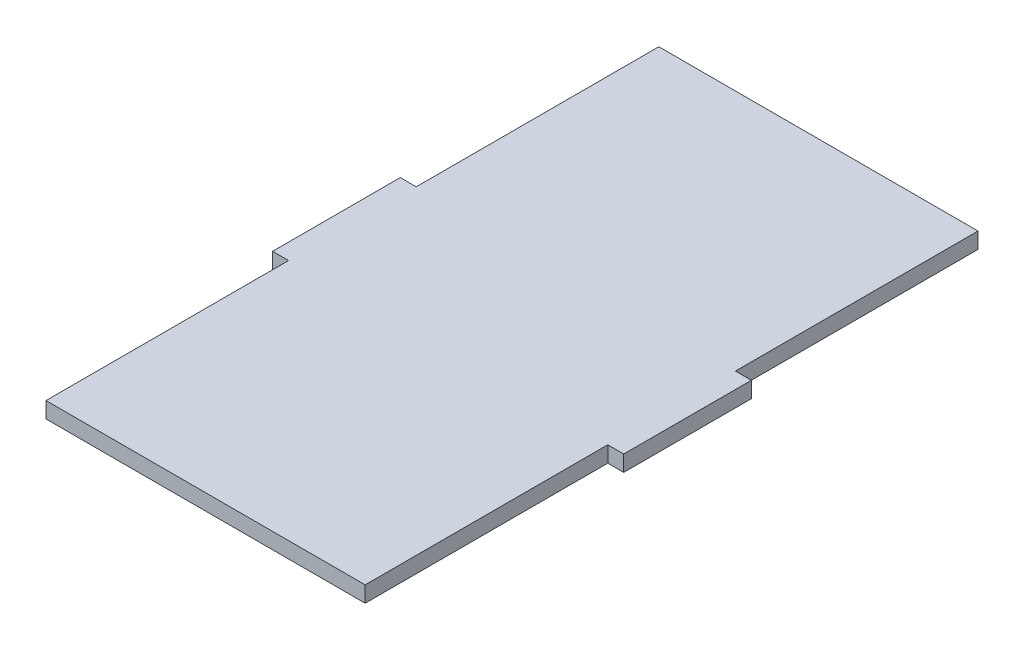
ISO-10303-21;
HEADER;
FILE_DESCRIPTION(('STEP AP214'),'2;1');
FILE_NAME('part.step','',(''),(''),'','','');
FILE_SCHEMA(('AUTOMOTIVE_DESIGN { 1 0 10303 214 1 1 1 1 }'));
ENDSEC;
DATA;
#1=APPLICATION_CONTEXT('core data for automotive mechanical design processes');
#2=APPLICATION_PROTOCOL_DEFINITION('international standard','automotive_design',2000,#1);
#3=PRODUCT_CONTEXT('',#1,'mechanical');
#4=PRODUCT('Part','Part','',(#3));
#5=PRODUCT_RELATED_PRODUCT_CATEGORY('part','',(#4));
#6=PRODUCT_DEFINITION_FORMATION('','',#4);
#7=PRODUCT_DEFINITION_CONTEXT('part definition',#1,'design');
#8=PRODUCT_DEFINITION('design','',#6,#7);
#9=PRODUCT_DEFINITION_SHAPE('','',#8);
#10=(LENGTH_UNIT() NAMED_UNIT(*) SI_UNIT(.MILLI.,.METRE.));
#11=(NAMED_UNIT(*) PLANE_ANGLE_UNIT() SI_UNIT($,.RADIAN.));
#12=(NAMED_UNIT(*) SI_UNIT($,.STERADIAN.) SOLID_ANGLE_UNIT());
#13=UNCERTAINTY_MEASURE_WITH_UNIT(LENGTH_MEASURE(1.E-05),#10,'distance_accuracy_value','');
#14=(GEOMETRIC_REPRESENTATION_CONTEXT(3) GLOBAL_UNCERTAINTY_ASSIGNED_CONTEXT((#13)) GLOBAL_UNIT_ASSIGNED_CONTEXT((#10,
#11,#12)) REPRESENTATION_CONTEXT('',''));
#15=CARTESIAN_POINT('',(0.,0.,0.));
#16=DIRECTION('',(0.,0.,1.));
#17=DIRECTION('',(1.,0.,0.));
#18=AXIS2_PLACEMENT_3D('',#15,#16,#17);
#19=CARTESIAN_POINT('',(0.,3.175,-19.05));
#20=DIRECTION('',(0.,0.,-1.));
#21=DIRECTION('',(-1.,0.,0.));
#22=AXIS2_PLACEMENT_3D('',#19,#20,#21);
#23=PLANE('',#22);
#24=DIRECTION('',(1.,0.,0.));
#25=VECTOR('',#24,1.);
#26=CARTESIAN_POINT('',(0.,0.,-19.05));
#27=LINE('',#26,#25);
#28=CARTESIAN_POINT('',(0.,0.,-19.05));
#29=VERTEX_POINT('',#28);
#30=CARTESIAN_POINT('',(3.175,0.,-19.05));
#31=VERTEX_POINT('',#30);
#32=EDGE_CURVE('E152',#29,#31,#27,.T.);
#33=ORIENTED_EDGE('',*,*,#32,.T.);
#34=DIRECTION('',(0.,-1.,0.));
#35=VECTOR('',#34,1.);
#36=CARTESIAN_POINT('',(3.175,3.175,-19.05));
#37=LINE('',#36,#35);
#38=CARTESIAN_POINT('',(3.175,3.175,-19.05));
#39=VERTEX_POINT('',#38);
#40=EDGE_CURVE('E11',#39,#31,#37,.T.);
#41=ORIENTED_EDGE('',*,*,#40,.F.);
#42=DIRECTION('',(1.,0.,0.));
#43=VECTOR('',#42,1.);
#44=CARTESIAN_POINT('',(0.,3.175,-19.05));
#45=LINE('',#44,#43);
#46=CARTESIAN_POINT('',(0.,3.175,-19.05));
#47=VERTEX_POINT('',#46);
#48=EDGE_CURVE('E98',#47,#39,#45,.T.);
#49=ORIENTED_EDGE('',*,*,#48,.F.);
#50=DIRECTION('',(0.,-1.,0.));
#51=VECTOR('',#50,1.);
#52=CARTESIAN_POINT('',(0.,3.175,-19.05));
#53=LINE('',#52,#51);
#54=EDGE_CURVE('E49',#47,#29,#53,.T.);
#55=ORIENTED_EDGE('',*,*,#54,.T.);
#56=EDGE_LOOP('',(#33,#41,#49,#55));
#57=FACE_BOUND('',#56,.T.);
#58=ADVANCED_FACE('F33',(#57),#23,.F.);
#59=CARTESIAN_POINT('',(3.175,3.175,29.21));
#60=DIRECTION('',(-1.,0.,0.));
#61=DIRECTION('',(0.,0.,1.));
#62=AXIS2_PLACEMENT_3D('',#59,#60,#61);
#63=PLANE('',#62);
#64=DIRECTION('',(0.,0.,-1.));
#65=VECTOR('',#64,1.);
#66=CARTESIAN_POINT('',(3.175,0.,29.21));
#67=LINE('',#66,#65);
#68=CARTESIAN_POINT('',(3.175,0.,29.21));
#69=VERTEX_POINT('',#68);
#70=EDGE_CURVE('E154',#69,#31,#67,.T.);
#71=ORIENTED_EDGE('',*,*,#70,.F.);
#72=DIRECTION('',(0.,-1.,0.));
#73=VECTOR('',#72,1.);
#74=CARTESIAN_POINT('',(3.175,3.175,29.21));
#75=LINE('',#74,#73);
#76=CARTESIAN_POINT('',(3.175,3.175,29.21));
#77=VERTEX_POINT('',#76);
#78=EDGE_CURVE('E41',#77,#69,#75,.T.);
#79=ORIENTED_EDGE('',*,*,#78,.F.);
#80=DIRECTION('',(0.,0.,-1.));
#81=VECTOR('',#80,1.);
#82=CARTESIAN_POINT('',(3.175,3.175,29.21));
#83=LINE('',#82,#81);
#84=EDGE_CURVE('E211',#77,#39,#83,.T.);
#85=ORIENTED_EDGE('',*,*,#84,.T.);
#86=ORIENTED_EDGE('',*,*,#40,.T.);
#87=EDGE_LOOP('',(#71,#79,#85,#86));
#88=FACE_BOUND('',#87,.T.);
#89=ADVANCED_FACE('F210',(#88),#63,.T.);
#90=CARTESIAN_POINT('',(3.175,3.175,29.21));
#91=DIRECTION('',(0.,0.,-1.));
#92=DIRECTION('',(-1.,0.,0.));
#93=AXIS2_PLACEMENT_3D('',#90,#91,#92);
#94=PLANE('',#93);
#95=DIRECTION('',(1.,0.,0.));
#96=VECTOR('',#95,1.);
#97=CARTESIAN_POINT('',(3.175,0.,29.21));
#98=LINE('',#97,#96);
#99=CARTESIAN_POINT('',(66.675,0.,29.21));
#100=VERTEX_POINT('',#99);
#101=EDGE_CURVE('E157',#69,#100,#98,.T.);
#102=ORIENTED_EDGE('',*,*,#101,.T.);
#103=DIRECTION('',(0.,-1.,0.));
#104=VECTOR('',#103,1.);
#105=CARTESIAN_POINT('',(66.675,3.175,29.21));
#106=LINE('',#105,#104);
#107=CARTESIAN_POINT('',(66.675,3.175,29.21));
#108=VERTEX_POINT('',#107);
#109=EDGE_CURVE('E196',#108,#100,#106,.T.);
#110=ORIENTED_EDGE('',*,*,#109,.F.);
#111=DIRECTION('',(1.,0.,0.));
#112=VECTOR('',#111,1.);
#113=CARTESIAN_POINT('',(3.175,3.175,29.21));
#114=LINE('',#113,#112);
#115=EDGE_CURVE('E203',#77,#108,#114,.T.);
#116=ORIENTED_EDGE('',*,*,#115,.F.);
#117=ORIENTED_EDGE('',*,*,#78,.T.);
#118=EDGE_LOOP('',(#102,#110,#116,#117));
#119=FACE_BOUND('',#118,.T.);
#120=ADVANCED_FACE('F201',(#119),#94,.F.);
#121=CARTESIAN_POINT('',(66.675,3.175,29.21));
#122=DIRECTION('',(-1.,0.,0.));
#123=DIRECTION('',(0.,0.,1.));
#124=AXIS2_PLACEMENT_3D('',#121,#122,#123);
#125=PLANE('',#124);
#126=DIRECTION('',(0.,0.,-1.));
#127=VECTOR('',#126,1.);
#128=CARTESIAN_POINT('',(66.675,0.,29.21));
#129=LINE('',#128,#127);
#130=CARTESIAN_POINT('',(66.675,0.,-19.05));
#131=VERTEX_POINT('',#130);
#132=EDGE_CURVE('E159',#100,#131,#129,.T.);
#133=ORIENTED_EDGE('',*,*,#132,.T.);
#134=DIRECTION('',(0.,-1.,0.));
#135=VECTOR('',#134,1.);
#136=CARTESIAN_POINT('',(66.675,3.175,-19.05));
#137=LINE('',#136,#135);
#138=CARTESIAN_POINT('',(66.675,3.175,-19.05));
#139=VERTEX_POINT('',#138);
#140=EDGE_CURVE('E194',#139,#131,#137,.T.);
#141=ORIENTED_EDGE('',*,*,#140,.F.);
#142=DIRECTION('',(0.,0.,-1.));
#143=VECTOR('',#142,1.);
#144=CARTESIAN_POINT('',(66.675,3.175,29.21));
#145=LINE('',#144,#143);
#146=EDGE_CURVE('E353',#108,#139,#145,.T.);
#147=ORIENTED_EDGE('',*,*,#146,.F.);
#148=ORIENTED_EDGE('',*,*,#109,.T.);
#149=EDGE_LOOP('',(#133,#141,#147,#148));
#150=FACE_BOUND('',#149,.T.);
#151=ADVANCED_FACE('F229',(#150),#125,.F.);
#152=CARTESIAN_POINT('',(69.85,3.175,-19.05));
#153=DIRECTION('',(0.,0.,1.));
#154=DIRECTION('',(1.,0.,0.));
#155=AXIS2_PLACEMENT_3D('',#152,#153,#154);
#156=PLANE('',#155);
#157=DIRECTION('',(-1.,0.,0.));
#158=VECTOR('',#157,1.);
#159=CARTESIAN_POINT('',(69.85,0.,-19.05));
#160=LINE('',#159,#158);
#161=CARTESIAN_POINT('',(69.85,0.,-19.05));
#162=VERTEX_POINT('',#161);
#163=EDGE_CURVE('E162',#162,#131,#160,.T.);
#164=ORIENTED_EDGE('',*,*,#163,.F.);
#165=DIRECTION('',(0.,-1.,0.));
#166=VECTOR('',#165,1.);
#167=CARTESIAN_POINT('',(69.85,3.175,-19.05));
#168=LINE('',#167,#166);
#169=CARTESIAN_POINT('',(69.85,3.175,-19.05));
#170=VERTEX_POINT('',#169);
#171=EDGE_CURVE('E192',#170,#162,#168,.T.);
#172=ORIENTED_EDGE('',*,*,#171,.F.);
#173=DIRECTION('',(-1.,0.,0.));
#174=VECTOR('',#173,1.);
#175=CARTESIAN_POINT('',(69.85,3.175,-19.05));
#176=LINE('',#175,#174);
#177=EDGE_CURVE('E351',#170,#139,#176,.T.);
#178=ORIENTED_EDGE('',*,*,#177,.T.);
#179=ORIENTED_EDGE('',*,*,#140,.T.);
#180=EDGE_LOOP('',(#164,#172,#178,#179));
#181=FACE_BOUND('',#180,.T.);
#182=ADVANCED_FACE('F234',(#181),#156,.T.);
#183=CARTESIAN_POINT('',(69.85,3.175,-19.05));
#184=DIRECTION('',(-1.,0.,0.));
#185=DIRECTION('',(0.,0.,1.));
#186=AXIS2_PLACEMENT_3D('',#183,#184,#185);
#187=PLANE('',#186);
#188=DIRECTION('',(0.,0.,-1.));
#189=VECTOR('',#188,1.);
#190=CARTESIAN_POINT('',(69.85,0.,-19.05));
#191=LINE('',#190,#189);
#192=CARTESIAN_POINT('',(69.85,0.,-44.45));
#193=VERTEX_POINT('',#192);
#194=EDGE_CURVE('E165',#162,#193,#191,.T.);
#195=ORIENTED_EDGE('',*,*,#194,.T.);
#196=DIRECTION('',(0.,-1.,0.));
#197=VECTOR('',#196,1.);
#198=CARTESIAN_POINT('',(69.85,3.175,-44.45));
#199=LINE('',#198,#197);
#200=CARTESIAN_POINT('',(69.85,3.175,-44.45));
#201=VERTEX_POINT('',#200);
#202=EDGE_CURVE('E189',#201,#193,#199,.T.);
#203=ORIENTED_EDGE('',*,*,#202,.F.);
#204=DIRECTION('',(0.,0.,-1.));
#205=VECTOR('',#204,1.);
#206=CARTESIAN_POINT('',(69.85,3.175,-19.05));
#207=LINE('',#206,#205);
#208=EDGE_CURVE('E346',#170,#201,#207,.T.);
#209=ORIENTED_EDGE('',*,*,#208,.F.);
#210=ORIENTED_EDGE('',*,*,#171,.T.);
#211=EDGE_LOOP('',(#195,#203,#209,#210));
#212=FACE_BOUND('',#211,.T.);
#213=ADVANCED_FACE('F238',(#212),#187,.F.);
#214=CARTESIAN_POINT('',(69.85,3.175,-44.45));
#215=DIRECTION('',(0.,0.,1.));
#216=DIRECTION('',(1.,0.,0.));
#217=AXIS2_PLACEMENT_3D('',#214,#215,#216);
#218=PLANE('',#217);
#219=DIRECTION('',(-1.,0.,0.));
#220=VECTOR('',#219,1.);
#221=CARTESIAN_POINT('',(69.85,0.,-44.45));
#222=LINE('',#221,#220);
#223=CARTESIAN_POINT('',(66.675,0.,-44.45));
#224=VERTEX_POINT('',#223);
#225=EDGE_CURVE('E167',#193,#224,#222,.T.);
#226=ORIENTED_EDGE('',*,*,#225,.T.);
#227=DIRECTION('',(0.,-1.,0.));
#228=VECTOR('',#227,1.);
#229=CARTESIAN_POINT('',(66.675,3.175,-44.45));
#230=LINE('',#229,#228);
#231=CARTESIAN_POINT('',(66.675,3.175,-44.45));
#232=VERTEX_POINT('',#231);
#233=EDGE_CURVE('E187',#232,#224,#230,.T.);
#234=ORIENTED_EDGE('',*,*,#233,.F.);
#235=DIRECTION('',(-1.,0.,0.));
#236=VECTOR('',#235,1.);
#237=CARTESIAN_POINT('',(69.85,3.175,-44.45));
#238=LINE('',#237,#236);
#239=EDGE_CURVE('E344',#201,#232,#238,.T.);
#240=ORIENTED_EDGE('',*,*,#239,.F.);
#241=ORIENTED_EDGE('',*,*,#202,.T.);
#242=EDGE_LOOP('',(#226,#234,#240,#241));
#243=FACE_BOUND('',#242,.T.);
#244=ADVANCED_FACE('F242',(#243),#218,.F.);
#245=CARTESIAN_POINT('',(66.675,3.175,-92.71));
#246=DIRECTION('',(1.,0.,0.));
#247=DIRECTION('',(0.,0.,-1.));
#248=AXIS2_PLACEMENT_3D('',#245,#246,#247);
#249=PLANE('',#248);
#250=DIRECTION('',(0.,0.,1.));
#251=VECTOR('',#250,1.);
#252=CARTESIAN_POINT('',(66.675,0.,-92.71));
#253=LINE('',#252,#251);
#254=CARTESIAN_POINT('',(66.675,0.,-92.71));
#255=VERTEX_POINT('',#254);
#256=EDGE_CURVE('E170',#255,#224,#253,.T.);
#257=ORIENTED_EDGE('',*,*,#256,.F.);
#258=DIRECTION('',(0.,-1.,0.));
#259=VECTOR('',#258,1.);
#260=CARTESIAN_POINT('',(66.675,3.175,-92.71));
#261=LINE('',#260,#259);
#262=CARTESIAN_POINT('',(66.675,3.175,-92.71));
#263=VERTEX_POINT('',#262);
#264=EDGE_CURVE('E185',#263,#255,#261,.T.);
#265=ORIENTED_EDGE('',*,*,#264,.F.);
#266=DIRECTION('',(0.,0.,1.));
#267=VECTOR('',#266,1.);
#268=CARTESIAN_POINT('',(66.675,3.175,-92.71));
#269=LINE('',#268,#267);
#270=EDGE_CURVE('E341',#263,#232,#269,.T.);
#271=ORIENTED_EDGE('',*,*,#270,.T.);
#272=ORIENTED_EDGE('',*,*,#233,.T.);
#273=EDGE_LOOP('',(#257,#265,#271,#272));
#274=FACE_BOUND('',#273,.T.);
#275=ADVANCED_FACE('F246',(#274),#249,.T.);
#276=CARTESIAN_POINT('',(3.17499999999992,3.175,-92.71));
#277=DIRECTION('',(0.,0.,-1.));
#278=DIRECTION('',(-1.,0.,0.));
#279=AXIS2_PLACEMENT_3D('',#276,#277,#278);
#280=PLANE('',#279);
#281=DIRECTION('',(1.,0.,0.));
#282=VECTOR('',#281,1.);
#283=CARTESIAN_POINT('',(3.17499999999992,0.,-92.71));
#284=LINE('',#283,#282);
#285=CARTESIAN_POINT('',(3.17499999999992,0.,-92.71));
#286=VERTEX_POINT('',#285);
#287=EDGE_CURVE('E173',#286,#255,#284,.T.);
#288=ORIENTED_EDGE('',*,*,#287,.F.);
#289=DIRECTION('',(0.,-1.,0.));
#290=VECTOR('',#289,1.);
#291=CARTESIAN_POINT('',(3.17499999999992,3.175,-92.71));
#292=LINE('',#291,#290);
#293=CARTESIAN_POINT('',(3.17499999999992,3.175,-92.71));
#294=VERTEX_POINT('',#293);
#295=EDGE_CURVE('E144',#294,#286,#292,.T.);
#296=ORIENTED_EDGE('',*,*,#295,.F.);
#297=DIRECTION('',(1.,0.,0.));
#298=VECTOR('',#297,1.);
#299=CARTESIAN_POINT('',(3.17499999999992,3.175,-92.71));
#300=LINE('',#299,#298);
#301=EDGE_CURVE('E134',#294,#263,#300,.T.);
#302=ORIENTED_EDGE('',*,*,#301,.T.);
#303=ORIENTED_EDGE('',*,*,#264,.T.);
#304=EDGE_LOOP('',(#288,#296,#302,#303));
#305=FACE_BOUND('',#304,.T.);
#306=ADVANCED_FACE('F250',(#305),#280,.T.);
#307=CARTESIAN_POINT('',(3.17499999999992,3.175,-92.71));
#308=DIRECTION('',(1.,0.,0.));
#309=DIRECTION('',(0.,0.,-1.));
#310=AXIS2_PLACEMENT_3D('',#307,#308,#309);
#311=PLANE('',#310);
#312=DIRECTION('',(0.,0.,1.));
#313=VECTOR('',#312,1.);
#314=CARTESIAN_POINT('',(3.17499999999992,0.,-92.71));
#315=LINE('',#314,#313);
#316=CARTESIAN_POINT('',(3.17499999999998,0.,-44.45));
#317=VERTEX_POINT('',#316);
#318=EDGE_CURVE('E141',#286,#317,#315,.T.);
#319=ORIENTED_EDGE('',*,*,#318,.T.);
#320=DIRECTION('',(0.,-1.,0.));
#321=VECTOR('',#320,1.);
#322=CARTESIAN_POINT('',(3.17499999999998,3.175,-44.45));
#323=LINE('',#322,#321);
#324=CARTESIAN_POINT('',(3.17499999999998,3.175,-44.45));
#325=VERTEX_POINT('',#324);
#326=EDGE_CURVE('E138',#325,#317,#323,.T.);
#327=ORIENTED_EDGE('',*,*,#326,.F.);
#328=DIRECTION('',(0.,0.,1.));
#329=VECTOR('',#328,1.);
#330=CARTESIAN_POINT('',(3.17499999999992,3.175,-92.71));
#331=LINE('',#330,#329);
#332=EDGE_CURVE('E127',#294,#325,#331,.T.);
#333=ORIENTED_EDGE('',*,*,#332,.F.);
#334=ORIENTED_EDGE('',*,*,#295,.T.);
#335=EDGE_LOOP('',(#319,#327,#333,#334));
#336=FACE_BOUND('',#335,.T.);
#337=ADVANCED_FACE('F139',(#336),#311,.F.);
#338=CARTESIAN_POINT('',(0.,3.175,-44.45));
#339=DIRECTION('',(0.,0.,-1.));
#340=DIRECTION('',(-1.,0.,0.));
#341=AXIS2_PLACEMENT_3D('',#338,#339,#340);
#342=PLANE('',#341);
#343=DIRECTION('',(1.,0.,0.));
#344=VECTOR('',#343,1.);
#345=CARTESIAN_POINT('',(0.,0.,-44.45));
#346=LINE('',#345,#344);
#347=CARTESIAN_POINT('',(0.,0.,-44.45));
#348=VERTEX_POINT('',#347);
#349=EDGE_CURVE('E177',#348,#317,#346,.T.);
#350=ORIENTED_EDGE('',*,*,#349,.F.);
#351=DIRECTION('',(0.,-1.,0.));
#352=VECTOR('',#351,1.);
#353=CARTESIAN_POINT('',(0.,3.175,-44.45));
#354=LINE('',#353,#352);
#355=CARTESIAN_POINT('',(0.,3.175,-44.45));
#356=VERTEX_POINT('',#355);
#357=EDGE_CURVE('E86',#356,#348,#354,.T.);
#358=ORIENTED_EDGE('',*,*,#357,.F.);
#359=DIRECTION('',(1.,0.,0.));
#360=VECTOR('',#359,1.);
#361=CARTESIAN_POINT('',(0.,3.175,-44.45));
#362=LINE('',#361,#360);
#363=EDGE_CURVE('E131',#356,#325,#362,.T.);
#364=ORIENTED_EDGE('',*,*,#363,.T.);
#365=ORIENTED_EDGE('',*,*,#326,.T.);
#366=EDGE_LOOP('',(#350,#358,#364,#365));
#367=FACE_BOUND('',#366,.T.);
#368=ADVANCED_FACE('F146',(#367),#342,.T.);
#369=CARTESIAN_POINT('',(0.,3.175,-19.05));
#370=DIRECTION('',(-1.,0.,0.));
#371=DIRECTION('',(0.,0.,1.));
#372=AXIS2_PLACEMENT_3D('',#369,#370,#371);
#373=PLANE('',#372);
#374=DIRECTION('',(0.,0.,-1.));
#375=VECTOR('',#374,1.);
#376=CARTESIAN_POINT('',(0.,0.,-19.05));
#377=LINE('',#376,#375);
#378=EDGE_CURVE('E179',#29,#348,#377,.T.);
#379=ORIENTED_EDGE('',*,*,#378,.F.);
#380=ORIENTED_EDGE('',*,*,#54,.F.);
#381=DIRECTION('',(0.,0.,-1.));
#382=VECTOR('',#381,1.);
#383=CARTESIAN_POINT('',(0.,3.175,-19.05));
#384=LINE('',#383,#382);
#385=EDGE_CURVE('E147',#47,#356,#384,.T.);
#386=ORIENTED_EDGE('',*,*,#385,.T.);
#387=ORIENTED_EDGE('',*,*,#357,.T.);
#388=EDGE_LOOP('',(#379,#380,#386,#387));
#389=FACE_BOUND('',#388,.T.);
#390=ADVANCED_FACE('F212',(#389),#373,.T.);
#391=CARTESIAN_POINT('',(0.,3.175,0.));
#392=DIRECTION('',(0.,1.,0.));
#393=DIRECTION('',(0.,0.,1.));
#394=AXIS2_PLACEMENT_3D('',#391,#392,#393);
#395=PLANE('',#394);
#396=ORIENTED_EDGE('',*,*,#48,.T.);
#397=ORIENTED_EDGE('',*,*,#84,.F.);
#398=ORIENTED_EDGE('',*,*,#115,.T.);
#399=ORIENTED_EDGE('',*,*,#146,.T.);
#400=ORIENTED_EDGE('',*,*,#177,.F.);
#401=ORIENTED_EDGE('',*,*,#208,.T.);
#402=ORIENTED_EDGE('',*,*,#239,.T.);
#403=ORIENTED_EDGE('',*,*,#270,.F.);
#404=ORIENTED_EDGE('',*,*,#301,.F.);
#405=ORIENTED_EDGE('',*,*,#332,.T.);
#406=ORIENTED_EDGE('',*,*,#363,.F.);
#407=ORIENTED_EDGE('',*,*,#385,.F.);
#408=EDGE_LOOP('',(#396,#397,#398,#399,#400,#401,#402,#403,#404,#405,#406,#407));
#409=FACE_BOUND('',#408,.T.);
#410=ADVANCED_FACE('F129',(#409),#395,.T.);
#411=CARTESIAN_POINT('',(0.,0.,0.));
#412=DIRECTION('',(0.,1.,0.));
#413=DIRECTION('',(0.,0.,1.));
#414=AXIS2_PLACEMENT_3D('',#411,#412,#413);
#415=PLANE('',#414);
#416=ORIENTED_EDGE('',*,*,#32,.F.);
#417=ORIENTED_EDGE('',*,*,#378,.T.);
#418=ORIENTED_EDGE('',*,*,#349,.T.);
#419=ORIENTED_EDGE('',*,*,#318,.F.);
#420=ORIENTED_EDGE('',*,*,#287,.T.);
#421=ORIENTED_EDGE('',*,*,#256,.T.);
#422=ORIENTED_EDGE('',*,*,#225,.F.);
#423=ORIENTED_EDGE('',*,*,#194,.F.);
#424=ORIENTED_EDGE('',*,*,#163,.T.);
#425=ORIENTED_EDGE('',*,*,#132,.F.);
#426=ORIENTED_EDGE('',*,*,#101,.F.);
#427=ORIENTED_EDGE('',*,*,#70,.T.);
#428=EDGE_LOOP('',(#416,#417,#418,#419,#420,#421,#422,#423,#424,#425,#426,#427));
#429=FACE_BOUND('',#428,.T.);
#430=ADVANCED_FACE('F209',(#429),#415,.F.);
#431=CLOSED_SHELL('',(#58,#89,#120,#151,#182,#213,#244,#275,#306,#337,#368,#390,#410,#430));
#432=MANIFOLD_SOLID_BREP('B2',#431);
#433=ADVANCED_BREP_SHAPE_REPRESENTATION('',(#18,#432),#14);
#434=SHAPE_DEFINITION_REPRESENTATION(#9,#433);
ENDSEC;
END-ISO-10303-21;
